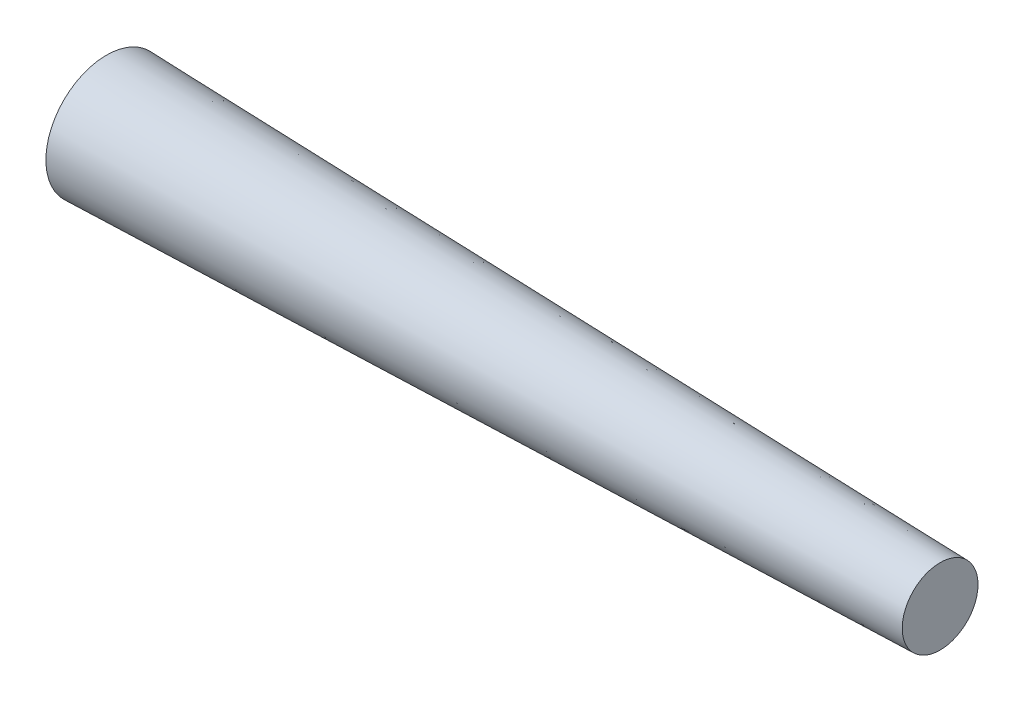
ISO-10303-21;
HEADER;
FILE_DESCRIPTION(('STEP AP214'),'2;1');
FILE_NAME('part.step','',(''),(''),'','','');
FILE_SCHEMA(('AUTOMOTIVE_DESIGN { 1 0 10303 214 1 1 1 1 }'));
ENDSEC;
DATA;
#1=APPLICATION_CONTEXT('core data for automotive mechanical design processes');
#2=APPLICATION_PROTOCOL_DEFINITION('international standard','automotive_design',2000,#1);
#3=PRODUCT_CONTEXT('',#1,'mechanical');
#4=PRODUCT('Part','Part','',(#3));
#5=PRODUCT_RELATED_PRODUCT_CATEGORY('part','',(#4));
#6=PRODUCT_DEFINITION_FORMATION('','',#4);
#7=PRODUCT_DEFINITION_CONTEXT('part definition',#1,'design');
#8=PRODUCT_DEFINITION('design','',#6,#7);
#9=PRODUCT_DEFINITION_SHAPE('','',#8);
#10=(LENGTH_UNIT() NAMED_UNIT(*) SI_UNIT(.MILLI.,.METRE.));
#11=(NAMED_UNIT(*) PLANE_ANGLE_UNIT() SI_UNIT($,.RADIAN.));
#12=(NAMED_UNIT(*) SI_UNIT($,.STERADIAN.) SOLID_ANGLE_UNIT());
#13=UNCERTAINTY_MEASURE_WITH_UNIT(LENGTH_MEASURE(1.E-05),#10,'distance_accuracy_value','');
#14=(GEOMETRIC_REPRESENTATION_CONTEXT(3) GLOBAL_UNCERTAINTY_ASSIGNED_CONTEXT((#13)) GLOBAL_UNIT_ASSIGNED_CONTEXT((#10,
#11,#12)) REPRESENTATION_CONTEXT('',''));
#15=CARTESIAN_POINT('',(0.,0.,0.));
#16=DIRECTION('',(0.,0.,1.));
#17=DIRECTION('',(1.,0.,0.));
#18=AXIS2_PLACEMENT_3D('',#15,#16,#17);
#19=CARTESIAN_POINT('',(0.,0.,0.));
#20=DIRECTION('',(-1.,0.,0.));
#21=DIRECTION('',(0.,0.,1.));
#22=AXIS2_PLACEMENT_3D('',#19,#20,#21);
#23=PLANE('',#22);
#24=CARTESIAN_POINT('',(0.,0.,0.));
#25=DIRECTION('',(1.,0.,0.));
#26=DIRECTION('',(0.,0.,-1.));
#27=AXIS2_PLACEMENT_3D('',#24,#25,#26);
#28=CIRCLE('',#27,8.);
#29=CARTESIAN_POINT('',(0.,0.,-8.));
#30=VERTEX_POINT('',#29);
#31=EDGE_CURVE('E10',#30,#30,#28,.T.);
#32=ORIENTED_EDGE('',*,*,#31,.F.);
#33=EDGE_LOOP('',(#32));
#34=FACE_BOUND('',#33,.T.);
#35=ADVANCED_FACE('F31',(#34),#23,.T.);
#36=CARTESIAN_POINT('',(110.,0.,0.));
#37=DIRECTION('',(-1.,0.,0.));
#38=DIRECTION('',(0.,0.,1.));
#39=AXIS2_PLACEMENT_3D('',#36,#37,#38);
#40=CONICAL_SURFACE('',#39,5.00000000000001,0.0272659684555943);
#41=ORIENTED_EDGE('',*,*,#31,.T.);
#42=EDGE_LOOP('',(#41));
#43=FACE_BOUND('',#42,.T.);
#44=CARTESIAN_POINT('',(110.,0.,0.));
#45=DIRECTION('',(1.,0.,0.));
#46=DIRECTION('',(0.,0.,-1.));
#47=AXIS2_PLACEMENT_3D('',#44,#45,#46);
#48=CIRCLE('',#47,5.00000000000001);
#49=CARTESIAN_POINT('',(110.,0.,-5.00000000000001));
#50=VERTEX_POINT('',#49);
#51=EDGE_CURVE('E37',#50,#50,#48,.T.);
#52=ORIENTED_EDGE('',*,*,#51,.F.);
#53=EDGE_LOOP('',(#52));
#54=FACE_BOUND('',#53,.T.);
#55=ADVANCED_FACE('F45',(#43,#54),#40,.T.);
#56=CARTESIAN_POINT('',(110.,5.00000000000001,0.));
#57=DIRECTION('',(1.,0.,0.));
#58=DIRECTION('',(0.,0.,-1.));
#59=AXIS2_PLACEMENT_3D('',#56,#57,#58);
#60=PLANE('',#59);
#61=ORIENTED_EDGE('',*,*,#51,.T.);
#62=EDGE_LOOP('',(#61));
#63=FACE_BOUND('',#62,.T.);
#64=ADVANCED_FACE('F43',(#63),#60,.T.);
#65=CLOSED_SHELL('',(#35,#55,#64));
#66=MANIFOLD_SOLID_BREP('B2',#65);
#67=ADVANCED_BREP_SHAPE_REPRESENTATION('',(#18,#66),#14);
#68=SHAPE_DEFINITION_REPRESENTATION(#9,#67);
ENDSEC;
END-ISO-10303-21;
